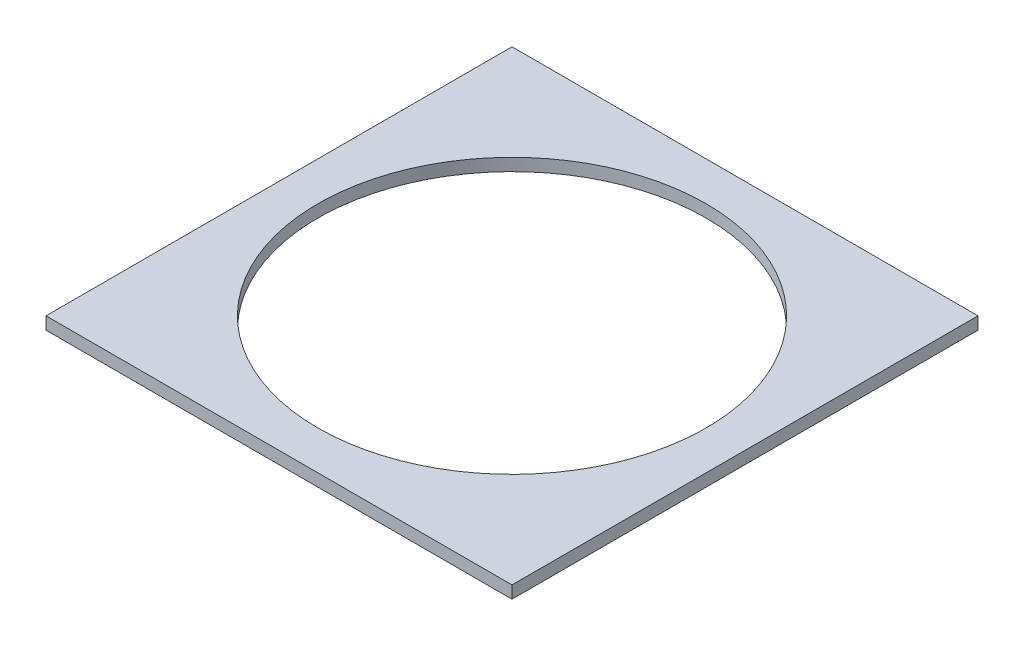
ISO-10303-21;
HEADER;
FILE_DESCRIPTION(('STEP AP214'),'2;1');
FILE_NAME('part.step','',(''),(''),'','','');
FILE_SCHEMA(('AUTOMOTIVE_DESIGN { 1 0 10303 214 1 1 1 1 }'));
ENDSEC;
DATA;
#1=APPLICATION_CONTEXT('core data for automotive mechanical design processes');
#2=APPLICATION_PROTOCOL_DEFINITION('international standard','automotive_design',2000,#1);
#3=PRODUCT_CONTEXT('',#1,'mechanical');
#4=PRODUCT('Part','Part','',(#3));
#5=PRODUCT_RELATED_PRODUCT_CATEGORY('part','',(#4));
#6=PRODUCT_DEFINITION_FORMATION('','',#4);
#7=PRODUCT_DEFINITION_CONTEXT('part definition',#1,'design');
#8=PRODUCT_DEFINITION('design','',#6,#7);
#9=PRODUCT_DEFINITION_SHAPE('','',#8);
#10=(LENGTH_UNIT() NAMED_UNIT(*) SI_UNIT(.MILLI.,.METRE.));
#11=(NAMED_UNIT(*) PLANE_ANGLE_UNIT() SI_UNIT($,.RADIAN.));
#12=(NAMED_UNIT(*) SI_UNIT($,.STERADIAN.) SOLID_ANGLE_UNIT());
#13=UNCERTAINTY_MEASURE_WITH_UNIT(LENGTH_MEASURE(1.E-05),#10,'distance_accuracy_value','');
#14=(GEOMETRIC_REPRESENTATION_CONTEXT(3) GLOBAL_UNCERTAINTY_ASSIGNED_CONTEXT((#13)) GLOBAL_UNIT_ASSIGNED_CONTEXT((#10,
#11,#12)) REPRESENTATION_CONTEXT('',''));
#15=CARTESIAN_POINT('',(0.,0.,0.));
#16=DIRECTION('',(0.,0.,1.));
#17=DIRECTION('',(1.,0.,0.));
#18=AXIS2_PLACEMENT_3D('',#15,#16,#17);
#19=CARTESIAN_POINT('',(150.,8.,150.));
#20=DIRECTION('',(-1.,0.,0.));
#21=DIRECTION('',(0.,0.,1.));
#22=AXIS2_PLACEMENT_3D('',#19,#20,#21);
#23=PLANE('',#22);
#24=DIRECTION('',(0.,0.,-1.));
#25=VECTOR('',#24,1.);
#26=CARTESIAN_POINT('',(150.,0.,150.));
#27=LINE('',#26,#25);
#28=CARTESIAN_POINT('',(150.,0.,150.));
#29=VERTEX_POINT('',#28);
#30=CARTESIAN_POINT('',(150.,0.,-150.));
#31=VERTEX_POINT('',#30);
#32=EDGE_CURVE('E97',#29,#31,#27,.T.);
#33=ORIENTED_EDGE('',*,*,#32,.T.);
#34=DIRECTION('',(0.,-1.,0.));
#35=VECTOR('',#34,1.);
#36=CARTESIAN_POINT('',(150.,8.,-150.));
#37=LINE('',#36,#35);
#38=CARTESIAN_POINT('',(150.,8.,-150.));
#39=VERTEX_POINT('',#38);
#40=EDGE_CURVE('E11',#39,#31,#37,.T.);
#41=ORIENTED_EDGE('',*,*,#40,.F.);
#42=DIRECTION('',(0.,0.,-1.));
#43=VECTOR('',#42,1.);
#44=CARTESIAN_POINT('',(150.,8.,150.));
#45=LINE('',#44,#43);
#46=CARTESIAN_POINT('',(150.,8.,150.));
#47=VERTEX_POINT('',#46);
#48=EDGE_CURVE('E84',#47,#39,#45,.T.);
#49=ORIENTED_EDGE('',*,*,#48,.F.);
#50=DIRECTION('',(0.,-1.,0.));
#51=VECTOR('',#50,1.);
#52=CARTESIAN_POINT('',(150.,8.,150.));
#53=LINE('',#52,#51);
#54=EDGE_CURVE('E93',#47,#29,#53,.T.);
#55=ORIENTED_EDGE('',*,*,#54,.T.);
#56=EDGE_LOOP('',(#33,#41,#49,#55));
#57=FACE_BOUND('',#56,.T.);
#58=ADVANCED_FACE('F32',(#57),#23,.F.);
#59=CARTESIAN_POINT('',(-150.,8.,-150.));
#60=DIRECTION('',(0.,0.,1.));
#61=DIRECTION('',(1.,0.,0.));
#62=AXIS2_PLACEMENT_3D('',#59,#60,#61);
#63=PLANE('',#62);
#64=DIRECTION('',(-1.,0.,0.));
#65=VECTOR('',#64,1.);
#66=CARTESIAN_POINT('',(-150.,0.,-150.));
#67=LINE('',#66,#65);
#68=CARTESIAN_POINT('',(-150.,0.,-150.));
#69=VERTEX_POINT('',#68);
#70=EDGE_CURVE('E88',#31,#69,#67,.T.);
#71=ORIENTED_EDGE('',*,*,#70,.T.);
#72=DIRECTION('',(0.,-1.,0.));
#73=VECTOR('',#72,1.);
#74=CARTESIAN_POINT('',(-150.,8.,-150.));
#75=LINE('',#74,#73);
#76=CARTESIAN_POINT('',(-150.,8.,-150.));
#77=VERTEX_POINT('',#76);
#78=EDGE_CURVE('E41',#77,#69,#75,.T.);
#79=ORIENTED_EDGE('',*,*,#78,.F.);
#80=DIRECTION('',(-1.,0.,0.));
#81=VECTOR('',#80,1.);
#82=CARTESIAN_POINT('',(-150.,8.,-150.));
#83=LINE('',#82,#81);
#84=EDGE_CURVE('E79',#39,#77,#83,.T.);
#85=ORIENTED_EDGE('',*,*,#84,.F.);
#86=ORIENTED_EDGE('',*,*,#40,.T.);
#87=EDGE_LOOP('',(#71,#79,#85,#86));
#88=FACE_BOUND('',#87,.T.);
#89=ADVANCED_FACE('F87',(#88),#63,.F.);
#90=CARTESIAN_POINT('',(-150.,8.,150.));
#91=DIRECTION('',(1.,0.,0.));
#92=DIRECTION('',(0.,0.,-1.));
#93=AXIS2_PLACEMENT_3D('',#90,#91,#92);
#94=PLANE('',#93);
#95=DIRECTION('',(0.,0.,1.));
#96=VECTOR('',#95,1.);
#97=CARTESIAN_POINT('',(-150.,0.,150.));
#98=LINE('',#97,#96);
#99=CARTESIAN_POINT('',(-150.,0.,150.));
#100=VERTEX_POINT('',#99);
#101=EDGE_CURVE('E66',#69,#100,#98,.T.);
#102=ORIENTED_EDGE('',*,*,#101,.T.);
#103=DIRECTION('',(0.,-1.,0.));
#104=VECTOR('',#103,1.);
#105=CARTESIAN_POINT('',(-150.,8.,150.));
#106=LINE('',#105,#104);
#107=CARTESIAN_POINT('',(-150.,8.,150.));
#108=VERTEX_POINT('',#107);
#109=EDGE_CURVE('E89',#108,#100,#106,.T.);
#110=ORIENTED_EDGE('',*,*,#109,.F.);
#111=DIRECTION('',(0.,0.,1.));
#112=VECTOR('',#111,1.);
#113=CARTESIAN_POINT('',(-150.,8.,150.));
#114=LINE('',#113,#112);
#115=EDGE_CURVE('E82',#77,#108,#114,.T.);
#116=ORIENTED_EDGE('',*,*,#115,.F.);
#117=ORIENTED_EDGE('',*,*,#78,.T.);
#118=EDGE_LOOP('',(#102,#110,#116,#117));
#119=FACE_BOUND('',#118,.T.);
#120=ADVANCED_FACE('F91',(#119),#94,.F.);
#121=CARTESIAN_POINT('',(-150.,8.,150.));
#122=DIRECTION('',(0.,0.,-1.));
#123=DIRECTION('',(-1.,0.,0.));
#124=AXIS2_PLACEMENT_3D('',#121,#122,#123);
#125=PLANE('',#124);
#126=DIRECTION('',(1.,0.,0.));
#127=VECTOR('',#126,1.);
#128=CARTESIAN_POINT('',(-150.,0.,150.));
#129=LINE('',#128,#127);
#130=EDGE_CURVE('E72',#100,#29,#129,.T.);
#131=ORIENTED_EDGE('',*,*,#130,.T.);
#132=ORIENTED_EDGE('',*,*,#54,.F.);
#133=DIRECTION('',(1.,0.,0.));
#134=VECTOR('',#133,1.);
#135=CARTESIAN_POINT('',(-150.,8.,150.));
#136=LINE('',#135,#134);
#137=EDGE_CURVE('E49',#108,#47,#136,.T.);
#138=ORIENTED_EDGE('',*,*,#137,.F.);
#139=ORIENTED_EDGE('',*,*,#109,.T.);
#140=EDGE_LOOP('',(#131,#132,#138,#139));
#141=FACE_BOUND('',#140,.T.);
#142=ADVANCED_FACE('F104',(#141),#125,.F.);
#143=CARTESIAN_POINT('',(0.,8.,0.));
#144=DIRECTION('',(0.,-1.,0.));
#145=DIRECTION('',(0.,0.,-1.));
#146=AXIS2_PLACEMENT_3D('',#143,#144,#145);
#147=PLANE('',#146);
#148=CARTESIAN_POINT('',(0.,8.,0.));
#149=DIRECTION('',(0.,1.,0.));
#150=DIRECTION('',(0.,0.,1.));
#151=AXIS2_PLACEMENT_3D('',#148,#149,#150);
#152=CIRCLE('',#151,125.);
#153=CARTESIAN_POINT('',(0.,8.,125.));
#154=VERTEX_POINT('',#153);
#155=EDGE_CURVE('E110',#154,#154,#152,.T.);
#156=ORIENTED_EDGE('',*,*,#155,.F.);
#157=EDGE_LOOP('',(#156));
#158=FACE_BOUND('',#157,.T.);
#159=ORIENTED_EDGE('',*,*,#48,.T.);
#160=ORIENTED_EDGE('',*,*,#84,.T.);
#161=ORIENTED_EDGE('',*,*,#115,.T.);
#162=ORIENTED_EDGE('',*,*,#137,.T.);
#163=EDGE_LOOP('',(#159,#160,#161,#162));
#164=FACE_BOUND('',#163,.T.);
#165=ADVANCED_FACE('F80',(#158,#164),#147,.F.);
#166=CARTESIAN_POINT('',(0.,0.,0.));
#167=DIRECTION('',(0.,-1.,0.));
#168=DIRECTION('',(0.,0.,-1.));
#169=AXIS2_PLACEMENT_3D('',#166,#167,#168);
#170=PLANE('',#169);
#171=CARTESIAN_POINT('',(0.,0.,0.));
#172=DIRECTION('',(0.,-1.,0.));
#173=DIRECTION('',(0.,0.,-1.));
#174=AXIS2_PLACEMENT_3D('',#171,#172,#173);
#175=CIRCLE('',#174,125.);
#176=CARTESIAN_POINT('',(0.,0.,-125.));
#177=VERTEX_POINT('',#176);
#178=EDGE_CURVE('E35',#177,#177,#175,.T.);
#179=ORIENTED_EDGE('',*,*,#178,.F.);
#180=EDGE_LOOP('',(#179));
#181=FACE_BOUND('',#180,.T.);
#182=ORIENTED_EDGE('',*,*,#32,.F.);
#183=ORIENTED_EDGE('',*,*,#130,.F.);
#184=ORIENTED_EDGE('',*,*,#101,.F.);
#185=ORIENTED_EDGE('',*,*,#70,.F.);
#186=EDGE_LOOP('',(#182,#183,#184,#185));
#187=FACE_BOUND('',#186,.T.);
#188=ADVANCED_FACE('F107',(#181,#187),#170,.T.);
#189=CARTESIAN_POINT('',(0.,-2.,0.));
#190=DIRECTION('',(0.,1.,0.));
#191=DIRECTION('',(0.,0.,1.));
#192=AXIS2_PLACEMENT_3D('',#189,#190,#191);
#193=CYLINDRICAL_SURFACE('',#192,125.);
#194=ORIENTED_EDGE('',*,*,#178,.T.);
#195=EDGE_LOOP('',(#194));
#196=FACE_BOUND('',#195,.T.);
#197=ORIENTED_EDGE('',*,*,#155,.T.);
#198=EDGE_LOOP('',(#197));
#199=FACE_BOUND('',#198,.T.);
#200=ADVANCED_FACE('F117',(#196,#199),#193,.F.);
#201=CLOSED_SHELL('',(#58,#89,#120,#142,#165,#188,#200));
#202=MANIFOLD_SOLID_BREP('B2',#201);
#203=ADVANCED_BREP_SHAPE_REPRESENTATION('',(#18,#202),#14);
#204=SHAPE_DEFINITION_REPRESENTATION(#9,#203);
ENDSEC;
END-ISO-10303-21;
